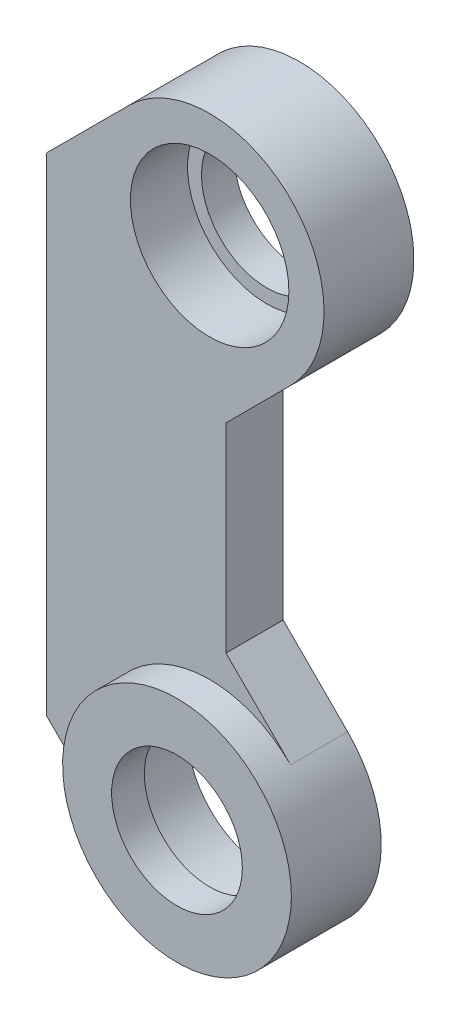
ISO-10303-21;
HEADER;
FILE_DESCRIPTION(('STEP AP214'),'2;1');
FILE_NAME('part.step','',(''),(''),'','','');
FILE_SCHEMA(('AUTOMOTIVE_DESIGN { 1 0 10303 214 1 1 1 1 }'));
ENDSEC;
DATA;
#1=APPLICATION_CONTEXT('core data for automotive mechanical design processes');
#2=APPLICATION_PROTOCOL_DEFINITION('international standard','automotive_design',2000,#1);
#3=PRODUCT_CONTEXT('',#1,'mechanical');
#4=PRODUCT('Part','Part','',(#3));
#5=PRODUCT_RELATED_PRODUCT_CATEGORY('part','',(#4));
#6=PRODUCT_DEFINITION_FORMATION('','',#4);
#7=PRODUCT_DEFINITION_CONTEXT('part definition',#1,'design');
#8=PRODUCT_DEFINITION('design','',#6,#7);
#9=PRODUCT_DEFINITION_SHAPE('','',#8);
#10=(LENGTH_UNIT() NAMED_UNIT(*) SI_UNIT(.MILLI.,.METRE.));
#11=(NAMED_UNIT(*) PLANE_ANGLE_UNIT() SI_UNIT($,.RADIAN.));
#12=(NAMED_UNIT(*) SI_UNIT($,.STERADIAN.) SOLID_ANGLE_UNIT());
#13=UNCERTAINTY_MEASURE_WITH_UNIT(LENGTH_MEASURE(1.E-05),#10,'distance_accuracy_value','');
#14=(GEOMETRIC_REPRESENTATION_CONTEXT(3) GLOBAL_UNCERTAINTY_ASSIGNED_CONTEXT((#13)) GLOBAL_UNIT_ASSIGNED_CONTEXT((#10,
#11,#12)) REPRESENTATION_CONTEXT('',''));
#15=CARTESIAN_POINT('',(0.,0.,0.));
#16=DIRECTION('',(0.,0.,1.));
#17=DIRECTION('',(1.,0.,0.));
#18=AXIS2_PLACEMENT_3D('',#15,#16,#17);
#19=CARTESIAN_POINT('',(-4.94974746830582,-4.94974746830584,3.5));
#20=DIRECTION('',(-0.707106781186546,-0.707106781186549,0.));
#21=DIRECTION('',(0.707106781186549,-0.707106781186546,0.));
#22=AXIS2_PLACEMENT_3D('',#19,#20,#21);
#23=PLANE('',#22);
#24=DIRECTION('',(-0.707106781186549,0.707106781186546,0.));
#25=VECTOR('',#24,1.);
#26=CARTESIAN_POINT('',(-4.94974746830582,-4.94974746830584,3.5));
#27=LINE('',#26,#25);
#28=CARTESIAN_POINT('',(-4.94974746830582,-4.94974746830584,3.5));
#29=VERTEX_POINT('',#28);
#30=CARTESIAN_POINT('',(-10.,0.100505063388337,3.5));
#31=VERTEX_POINT('',#30);
#32=EDGE_CURVE('E109',#29,#31,#27,.T.);
#33=ORIENTED_EDGE('',*,*,#32,.T.);
#34=DIRECTION('',(0.,0.,-1.));
#35=VECTOR('',#34,1.);
#36=CARTESIAN_POINT('',(-10.,0.10050506338834,3.5));
#37=LINE('',#36,#35);
#38=CARTESIAN_POINT('',(-10.,0.100505063388338,0.));
#39=VERTEX_POINT('',#38);
#40=EDGE_CURVE('E146',#31,#39,#37,.T.);
#41=ORIENTED_EDGE('',*,*,#40,.T.);
#42=DIRECTION('',(-0.707106781186549,0.707106781186546,0.));
#43=VECTOR('',#42,1.);
#44=CARTESIAN_POINT('',(-4.94974746830582,-4.94974746830584,0.));
#45=LINE('',#44,#43);
#46=CARTESIAN_POINT('',(-4.94974746830582,-4.94974746830584,0.));
#47=VERTEX_POINT('',#46);
#48=EDGE_CURVE('E111',#47,#39,#45,.T.);
#49=ORIENTED_EDGE('',*,*,#48,.F.);
#50=DIRECTION('',(0.,0.,-1.));
#51=VECTOR('',#50,1.);
#52=CARTESIAN_POINT('',(-4.94974746830582,-4.94974746830584,3.5));
#53=LINE('',#52,#51);
#54=EDGE_CURVE('E105',#29,#47,#53,.T.);
#55=ORIENTED_EDGE('',*,*,#54,.F.);
#56=EDGE_LOOP('',(#33,#41,#49,#55));
#57=FACE_BOUND('',#56,.T.);
#58=ADVANCED_FACE('F38',(#57),#23,.T.);
#59=CARTESIAN_POINT('',(0.,0.,3.5));
#60=DIRECTION('',(0.,0.,1.));
#61=DIRECTION('',(1.,0.,0.));
#62=AXIS2_PLACEMENT_3D('',#59,#60,#61);
#63=PLANE('',#62);
#64=CARTESIAN_POINT('',(0.,0.,3.5));
#65=DIRECTION('',(0.,0.,1.));
#66=DIRECTION('',(1.,0.,0.));
#67=AXIS2_PLACEMENT_3D('',#64,#65,#66);
#68=CIRCLE('',#67,7.);
#69=CARTESIAN_POINT('',(4.94974746830582,4.94974746830584,3.5));
#70=VERTEX_POINT('',#69);
#71=EDGE_CURVE('E123',#70,#29,#68,.T.);
#72=ORIENTED_EDGE('',*,*,#71,.F.);
#73=DIRECTION('',(-0.707106781186549,0.707106781186546,0.));
#74=VECTOR('',#73,1.);
#75=CARTESIAN_POINT('',(4.94974746830582,4.94974746830585,3.5));
#76=LINE('',#75,#74);
#77=CARTESIAN_POINT('',(0.999999999999977,8.89949493661167,3.5));
#78=VERTEX_POINT('',#77);
#79=EDGE_CURVE('E126',#70,#78,#76,.T.);
#80=ORIENTED_EDGE('',*,*,#79,.T.);
#81=DIRECTION('',(0.,1.,0.));
#82=VECTOR('',#81,1.);
#83=CARTESIAN_POINT('',(0.999999999999977,0.,3.5));
#84=LINE('',#83,#82);
#85=CARTESIAN_POINT('',(0.999999999999977,21.1005050633883,3.5));
#86=VERTEX_POINT('',#85);
#87=EDGE_CURVE('E63',#78,#86,#84,.T.);
#88=ORIENTED_EDGE('',*,*,#87,.T.);
#89=DIRECTION('',(0.707106781186549,0.707106781186546,0.));
#90=VECTOR('',#89,1.);
#91=CARTESIAN_POINT('',(-10.0502525316942,10.0502525316942,3.5));
#92=LINE('',#91,#90);
#93=CARTESIAN_POINT('',(4.94974746830582,25.0502525316942,3.5));
#94=VERTEX_POINT('',#93);
#95=EDGE_CURVE('E149',#86,#94,#92,.T.);
#96=ORIENTED_EDGE('',*,*,#95,.T.);
#97=CARTESIAN_POINT('',(0.,30.,3.5));
#98=DIRECTION('',(0.,0.,1.));
#99=DIRECTION('',(1.,0.,0.));
#100=AXIS2_PLACEMENT_3D('',#97,#98,#99);
#101=CIRCLE('',#100,7.);
#102=CARTESIAN_POINT('',(-4.94974746830582,34.9497474683058,3.5));
#103=VERTEX_POINT('',#102);
#104=EDGE_CURVE('E96',#94,#103,#101,.T.);
#105=ORIENTED_EDGE('',*,*,#104,.T.);
#106=DIRECTION('',(0.707106781186549,0.707106781186546,0.));
#107=VECTOR('',#106,1.);
#108=CARTESIAN_POINT('',(-19.9497474683058,19.9497474683059,3.5));
#109=LINE('',#108,#107);
#110=CARTESIAN_POINT('',(-10.,29.8994949366117,3.5));
#111=VERTEX_POINT('',#110);
#112=EDGE_CURVE('E127',#111,#103,#109,.T.);
#113=ORIENTED_EDGE('',*,*,#112,.F.);
#114=DIRECTION('',(0.,-1.,0.));
#115=VECTOR('',#114,1.);
#116=CARTESIAN_POINT('',(-10.,29.8994949366117,3.5));
#117=LINE('',#116,#115);
#118=EDGE_CURVE('E125',#111,#31,#117,.T.);
#119=ORIENTED_EDGE('',*,*,#118,.T.);
#120=ORIENTED_EDGE('',*,*,#32,.F.);
#121=EDGE_LOOP('',(#72,#80,#88,#96,#105,#113,#119,#120));
#122=FACE_BOUND('',#121,.T.);
#123=CARTESIAN_POINT('',(0.,30.,3.5));
#124=DIRECTION('',(0.,0.,1.));
#125=DIRECTION('',(1.,0.,0.));
#126=AXIS2_PLACEMENT_3D('',#123,#124,#125);
#127=CIRCLE('',#126,4.85);
#128=CARTESIAN_POINT('',(4.85,30.,3.5));
#129=VERTEX_POINT('',#128);
#130=EDGE_CURVE('E156',#129,#129,#127,.T.);
#131=ORIENTED_EDGE('',*,*,#130,.F.);
#132=EDGE_LOOP('',(#131));
#133=FACE_BOUND('',#132,.T.);
#134=ADVANCED_FACE('F120',(#122,#133),#63,.T.);
#135=CARTESIAN_POINT('',(0.,0.,0.));
#136=DIRECTION('',(0.,0.,1.));
#137=DIRECTION('',(1.,0.,0.));
#138=AXIS2_PLACEMENT_3D('',#135,#136,#137);
#139=PLANE('',#138);
#140=CARTESIAN_POINT('',(0.,30.,0.));
#141=DIRECTION('',(0.,0.,-1.));
#142=DIRECTION('',(-1.,0.,0.));
#143=AXIS2_PLACEMENT_3D('',#140,#141,#142);
#144=CIRCLE('',#143,7.);
#145=CARTESIAN_POINT('',(4.94974746830582,25.0502525316942,0.));
#146=VERTEX_POINT('',#145);
#147=CARTESIAN_POINT('',(-4.94974746830582,34.9497474683058,0.));
#148=VERTEX_POINT('',#147);
#149=EDGE_CURVE('E11',#146,#148,#144,.T.);
#150=ORIENTED_EDGE('',*,*,#149,.F.);
#151=DIRECTION('',(0.707106781186549,0.707106781186546,0.));
#152=VECTOR('',#151,1.);
#153=CARTESIAN_POINT('',(-10.0502525316942,10.0502525316942,0.));
#154=LINE('',#153,#152);
#155=CARTESIAN_POINT('',(0.999999999999977,21.1005050633883,0.));
#156=VERTEX_POINT('',#155);
#157=EDGE_CURVE('E148',#156,#146,#154,.T.);
#158=ORIENTED_EDGE('',*,*,#157,.F.);
#159=DIRECTION('',(0.,1.,0.));
#160=VECTOR('',#159,1.);
#161=CARTESIAN_POINT('',(0.999999999999977,0.,0.));
#162=LINE('',#161,#160);
#163=CARTESIAN_POINT('',(0.999999999999977,8.89949493661167,0.));
#164=VERTEX_POINT('',#163);
#165=EDGE_CURVE('E87',#164,#156,#162,.T.);
#166=ORIENTED_EDGE('',*,*,#165,.F.);
#167=DIRECTION('',(-0.707106781186549,0.707106781186546,0.));
#168=VECTOR('',#167,1.);
#169=CARTESIAN_POINT('',(4.94974746830582,4.94974746830585,0.));
#170=LINE('',#169,#168);
#171=CARTESIAN_POINT('',(4.94974746830582,4.94974746830584,0.));
#172=VERTEX_POINT('',#171);
#173=EDGE_CURVE('E170',#172,#164,#170,.T.);
#174=ORIENTED_EDGE('',*,*,#173,.F.);
#175=CARTESIAN_POINT('',(0.,0.,0.));
#176=DIRECTION('',(0.,0.,1.));
#177=DIRECTION('',(1.,0.,0.));
#178=AXIS2_PLACEMENT_3D('',#175,#176,#177);
#179=CIRCLE('',#178,7.);
#180=EDGE_CURVE('E168',#47,#172,#179,.T.);
#181=ORIENTED_EDGE('',*,*,#180,.F.);
#182=ORIENTED_EDGE('',*,*,#48,.T.);
#183=DIRECTION('',(0.,-1.,0.));
#184=VECTOR('',#183,1.);
#185=CARTESIAN_POINT('',(-10.,0.,0.));
#186=LINE('',#185,#184);
#187=CARTESIAN_POINT('',(-10.,29.8994949366117,0.));
#188=VERTEX_POINT('',#187);
#189=EDGE_CURVE('E42',#188,#39,#186,.T.);
#190=ORIENTED_EDGE('',*,*,#189,.F.);
#191=DIRECTION('',(0.707106781186549,0.707106781186546,0.));
#192=VECTOR('',#191,1.);
#193=CARTESIAN_POINT('',(-19.9497474683058,19.9497474683059,0.));
#194=LINE('',#193,#192);
#195=EDGE_CURVE('E164',#188,#148,#194,.T.);
#196=ORIENTED_EDGE('',*,*,#195,.T.);
#197=EDGE_LOOP('',(#150,#158,#166,#174,#181,#182,#190,#196));
#198=FACE_BOUND('',#197,.T.);
#199=CARTESIAN_POINT('',(0.,0.,0.));
#200=DIRECTION('',(0.,0.,1.));
#201=DIRECTION('',(1.,0.,0.));
#202=AXIS2_PLACEMENT_3D('',#199,#200,#201);
#203=CIRCLE('',#202,4.85);
#204=CARTESIAN_POINT('',(4.85,0.,0.));
#205=VERTEX_POINT('',#204);
#206=EDGE_CURVE('E173',#205,#205,#203,.T.);
#207=ORIENTED_EDGE('',*,*,#206,.T.);
#208=EDGE_LOOP('',(#207));
#209=FACE_BOUND('',#208,.T.);
#210=ADVANCED_FACE('F189',(#198,#209),#139,.F.);
#211=CARTESIAN_POINT('',(-10.0502525316942,10.0502525316942,3.5));
#212=DIRECTION('',(-0.707106781186546,0.707106781186549,0.));
#213=DIRECTION('',(-0.707106781186549,-0.707106781186546,0.));
#214=AXIS2_PLACEMENT_3D('',#211,#212,#213);
#215=PLANE('',#214);
#216=ORIENTED_EDGE('',*,*,#157,.T.);
#217=DIRECTION('',(0.,0.,-1.));
#218=VECTOR('',#217,1.);
#219=CARTESIAN_POINT('',(4.94974746830582,25.0502525316942,3.5));
#220=LINE('',#219,#218);
#221=EDGE_CURVE('E183',#94,#146,#220,.T.);
#222=ORIENTED_EDGE('',*,*,#221,.F.);
#223=ORIENTED_EDGE('',*,*,#95,.F.);
#224=DIRECTION('',(0.,0.,-1.));
#225=VECTOR('',#224,1.);
#226=CARTESIAN_POINT('',(0.999999999999977,21.1005050633883,3.5));
#227=LINE('',#226,#225);
#228=EDGE_CURVE('E161',#86,#156,#227,.T.);
#229=ORIENTED_EDGE('',*,*,#228,.T.);
#230=EDGE_LOOP('',(#216,#222,#223,#229));
#231=FACE_BOUND('',#230,.T.);
#232=ADVANCED_FACE('F40',(#231),#215,.F.);
#233=CARTESIAN_POINT('',(0.,30.,3.5));
#234=DIRECTION('',(0.,0.,-1.));
#235=DIRECTION('',(-1.,0.,0.));
#236=AXIS2_PLACEMENT_3D('',#233,#234,#235);
#237=CYLINDRICAL_SURFACE('',#236,7.);
#238=ORIENTED_EDGE('',*,*,#221,.T.);
#239=ORIENTED_EDGE('',*,*,#149,.T.);
#240=DIRECTION('',(0.,0.,-1.));
#241=VECTOR('',#240,1.);
#242=CARTESIAN_POINT('',(-4.94974746830582,34.9497474683058,3.5));
#243=LINE('',#242,#241);
#244=EDGE_CURVE('E115',#103,#148,#243,.T.);
#245=ORIENTED_EDGE('',*,*,#244,.F.);
#246=ORIENTED_EDGE('',*,*,#104,.F.);
#247=EDGE_LOOP('',(#238,#239,#245,#246));
#248=FACE_BOUND('',#247,.T.);
#249=CARTESIAN_POINT('',(0.,30.,-2.));
#250=DIRECTION('',(0.,0.,-1.));
#251=DIRECTION('',(-1.,0.,0.));
#252=AXIS2_PLACEMENT_3D('',#249,#250,#251);
#253=CIRCLE('',#252,7.);
#254=CARTESIAN_POINT('',(-7.,30.,-2.));
#255=VERTEX_POINT('',#254);
#256=EDGE_CURVE('E209',#255,#255,#253,.T.);
#257=ORIENTED_EDGE('',*,*,#256,.F.);
#258=EDGE_LOOP('',(#257));
#259=FACE_BOUND('',#258,.T.);
#260=ADVANCED_FACE('F204',(#248,#259),#237,.T.);
#261=CARTESIAN_POINT('',(-19.9497474683058,19.9497474683059,3.5));
#262=DIRECTION('',(-0.707106781186546,0.707106781186549,0.));
#263=DIRECTION('',(-0.707106781186549,-0.707106781186546,0.));
#264=AXIS2_PLACEMENT_3D('',#261,#262,#263);
#265=PLANE('',#264);
#266=DIRECTION('',(0.,0.,1.));
#267=VECTOR('',#266,1.);
#268=CARTESIAN_POINT('',(-10.,29.8994949366117,-0.5));
#269=LINE('',#268,#267);
#270=EDGE_CURVE('E54',#188,#111,#269,.T.);
#271=ORIENTED_EDGE('',*,*,#270,.T.);
#272=ORIENTED_EDGE('',*,*,#112,.T.);
#273=ORIENTED_EDGE('',*,*,#244,.T.);
#274=ORIENTED_EDGE('',*,*,#195,.F.);
#275=EDGE_LOOP('',(#271,#272,#273,#274));
#276=FACE_BOUND('',#275,.T.);
#277=ADVANCED_FACE('F202',(#276),#265,.T.);
#278=CARTESIAN_POINT('',(0.,0.,3.5));
#279=DIRECTION('',(0.,0.,-1.));
#280=DIRECTION('',(-1.,0.,0.));
#281=AXIS2_PLACEMENT_3D('',#278,#279,#280);
#282=CYLINDRICAL_SURFACE('',#281,7.);
#283=ORIENTED_EDGE('',*,*,#180,.T.);
#284=DIRECTION('',(0.,0.,-1.));
#285=VECTOR('',#284,1.);
#286=CARTESIAN_POINT('',(4.94974746830582,4.94974746830584,3.5));
#287=LINE('',#286,#285);
#288=EDGE_CURVE('E116',#70,#172,#287,.T.);
#289=ORIENTED_EDGE('',*,*,#288,.F.);
#290=ORIENTED_EDGE('',*,*,#71,.T.);
#291=ORIENTED_EDGE('',*,*,#54,.T.);
#292=EDGE_LOOP('',(#283,#289,#290,#291));
#293=FACE_BOUND('',#292,.T.);
#294=CARTESIAN_POINT('',(0.,0.,5.5));
#295=DIRECTION('',(0.,0.,1.));
#296=DIRECTION('',(1.,0.,0.));
#297=AXIS2_PLACEMENT_3D('',#294,#295,#296);
#298=CIRCLE('',#297,7.);
#299=CARTESIAN_POINT('',(7.,0.,5.5));
#300=VERTEX_POINT('',#299);
#301=EDGE_CURVE('E133',#300,#300,#298,.T.);
#302=ORIENTED_EDGE('',*,*,#301,.F.);
#303=EDGE_LOOP('',(#302));
#304=FACE_BOUND('',#303,.T.);
#305=ADVANCED_FACE('F130',(#293,#304),#282,.T.);
#306=CARTESIAN_POINT('',(4.94974746830582,4.94974746830585,3.5));
#307=DIRECTION('',(-0.707106781186546,-0.707106781186549,0.));
#308=DIRECTION('',(0.707106781186549,-0.707106781186546,0.));
#309=AXIS2_PLACEMENT_3D('',#306,#307,#308);
#310=PLANE('',#309);
#311=ORIENTED_EDGE('',*,*,#173,.T.);
#312=DIRECTION('',(0.,0.,-1.));
#313=VECTOR('',#312,1.);
#314=CARTESIAN_POINT('',(0.999999999999977,8.89949493661167,3.5));
#315=LINE('',#314,#313);
#316=EDGE_CURVE('E179',#78,#164,#315,.T.);
#317=ORIENTED_EDGE('',*,*,#316,.F.);
#318=ORIENTED_EDGE('',*,*,#79,.F.);
#319=ORIENTED_EDGE('',*,*,#288,.T.);
#320=EDGE_LOOP('',(#311,#317,#318,#319));
#321=FACE_BOUND('',#320,.T.);
#322=ADVANCED_FACE('F194',(#321),#310,.F.);
#323=CARTESIAN_POINT('',(0.,0.,3.5));
#324=DIRECTION('',(0.,0.,-1.));
#325=DIRECTION('',(-1.,0.,0.));
#326=AXIS2_PLACEMENT_3D('',#323,#324,#325);
#327=CYLINDRICAL_SURFACE('',#326,4.85);
#328=CARTESIAN_POINT('',(0.,0.,3.5));
#329=DIRECTION('',(0.,0.,1.));
#330=DIRECTION('',(1.,0.,0.));
#331=AXIS2_PLACEMENT_3D('',#328,#329,#330);
#332=CIRCLE('',#331,4.85);
#333=CARTESIAN_POINT('',(4.85,0.,3.5));
#334=VERTEX_POINT('',#333);
#335=EDGE_CURVE('E137',#334,#334,#332,.T.);
#336=ORIENTED_EDGE('',*,*,#335,.T.);
#337=EDGE_LOOP('',(#336));
#338=FACE_BOUND('',#337,.T.);
#339=ORIENTED_EDGE('',*,*,#206,.F.);
#340=EDGE_LOOP('',(#339));
#341=FACE_BOUND('',#340,.T.);
#342=ADVANCED_FACE('F249',(#338,#341),#327,.F.);
#343=CARTESIAN_POINT('',(0.999999999999977,0.,3.5));
#344=DIRECTION('',(-1.,0.,0.));
#345=DIRECTION('',(0.,0.,1.));
#346=AXIS2_PLACEMENT_3D('',#343,#344,#345);
#347=PLANE('',#346);
#348=ORIENTED_EDGE('',*,*,#165,.T.);
#349=ORIENTED_EDGE('',*,*,#228,.F.);
#350=ORIENTED_EDGE('',*,*,#87,.F.);
#351=ORIENTED_EDGE('',*,*,#316,.T.);
#352=EDGE_LOOP('',(#348,#349,#350,#351));
#353=FACE_BOUND('',#352,.T.);
#354=ADVANCED_FACE('F253',(#353),#347,.F.);
#355=CARTESIAN_POINT('',(0.,30.,3.5));
#356=DIRECTION('',(0.,0.,-1.));
#357=DIRECTION('',(-1.,0.,0.));
#358=AXIS2_PLACEMENT_3D('',#355,#356,#357);
#359=CYLINDRICAL_SURFACE('',#358,4.85);
#360=ORIENTED_EDGE('',*,*,#130,.T.);
#361=EDGE_LOOP('',(#360));
#362=FACE_BOUND('',#361,.T.);
#363=CARTESIAN_POINT('',(0.,30.,0.));
#364=DIRECTION('',(0.,0.,1.));
#365=DIRECTION('',(1.,0.,0.));
#366=AXIS2_PLACEMENT_3D('',#363,#364,#365);
#367=CIRCLE('',#366,4.85);
#368=CARTESIAN_POINT('',(4.85,30.,0.));
#369=VERTEX_POINT('',#368);
#370=EDGE_CURVE('E151',#369,#369,#367,.T.);
#371=ORIENTED_EDGE('',*,*,#370,.F.);
#372=EDGE_LOOP('',(#371));
#373=FACE_BOUND('',#372,.T.);
#374=ADVANCED_FACE('F258',(#362,#373),#359,.F.);
#375=CARTESIAN_POINT('',(-10.,29.8994949366117,-0.5));
#376=DIRECTION('',(-1.,0.,0.));
#377=DIRECTION('',(0.,-1.,0.));
#378=AXIS2_PLACEMENT_3D('',#375,#376,#377);
#379=PLANE('',#378);
#380=ORIENTED_EDGE('',*,*,#118,.F.);
#381=ORIENTED_EDGE('',*,*,#270,.F.);
#382=ORIENTED_EDGE('',*,*,#189,.T.);
#383=ORIENTED_EDGE('',*,*,#40,.F.);
#384=EDGE_LOOP('',(#380,#381,#382,#383));
#385=FACE_BOUND('',#384,.T.);
#386=ADVANCED_FACE('F186',(#385),#379,.T.);
#387=CARTESIAN_POINT('',(0.,0.,5.5));
#388=DIRECTION('',(0.,0.,1.));
#389=DIRECTION('',(1.,0.,0.));
#390=AXIS2_PLACEMENT_3D('',#387,#388,#389);
#391=PLANE('',#390);
#392=ORIENTED_EDGE('',*,*,#301,.T.);
#393=EDGE_LOOP('',(#392));
#394=FACE_BOUND('',#393,.T.);
#395=CARTESIAN_POINT('',(0.,0.,5.5));
#396=DIRECTION('',(0.,0.,1.));
#397=DIRECTION('',(1.,0.,0.));
#398=AXIS2_PLACEMENT_3D('',#395,#396,#397);
#399=CIRCLE('',#398,4.);
#400=CARTESIAN_POINT('',(4.,0.,5.5));
#401=VERTEX_POINT('',#400);
#402=EDGE_CURVE('E134',#401,#401,#399,.T.);
#403=ORIENTED_EDGE('',*,*,#402,.F.);
#404=EDGE_LOOP('',(#403));
#405=FACE_BOUND('',#404,.T.);
#406=ADVANCED_FACE('F267',(#394,#405),#391,.T.);
#407=CARTESIAN_POINT('',(0.,0.,3.5));
#408=DIRECTION('',(0.,0.,1.));
#409=DIRECTION('',(1.,0.,0.));
#410=AXIS2_PLACEMENT_3D('',#407,#408,#409);
#411=PLANE('',#410);
#412=ORIENTED_EDGE('',*,*,#335,.F.);
#413=EDGE_LOOP('',(#412));
#414=FACE_BOUND('',#413,.T.);
#415=CARTESIAN_POINT('',(0.,0.,3.5));
#416=DIRECTION('',(0.,0.,1.));
#417=DIRECTION('',(1.,0.,0.));
#418=AXIS2_PLACEMENT_3D('',#415,#416,#417);
#419=CIRCLE('',#418,4.);
#420=CARTESIAN_POINT('',(4.,0.,3.5));
#421=VERTEX_POINT('',#420);
#422=EDGE_CURVE('E140',#421,#421,#419,.T.);
#423=ORIENTED_EDGE('',*,*,#422,.T.);
#424=EDGE_LOOP('',(#423));
#425=FACE_BOUND('',#424,.T.);
#426=ADVANCED_FACE('F268',(#414,#425),#411,.F.);
#427=CARTESIAN_POINT('',(0.,0.,5.5));
#428=DIRECTION('',(0.,0.,-1.));
#429=DIRECTION('',(-1.,0.,0.));
#430=AXIS2_PLACEMENT_3D('',#427,#428,#429);
#431=CYLINDRICAL_SURFACE('',#430,4.);
#432=ORIENTED_EDGE('',*,*,#402,.T.);
#433=EDGE_LOOP('',(#432));
#434=FACE_BOUND('',#433,.T.);
#435=ORIENTED_EDGE('',*,*,#422,.F.);
#436=EDGE_LOOP('',(#435));
#437=FACE_BOUND('',#436,.T.);
#438=ADVANCED_FACE('F271',(#434,#437),#431,.F.);
#439=CARTESIAN_POINT('',(0.,30.,0.));
#440=DIRECTION('',(0.,0.,-1.));
#441=DIRECTION('',(-1.,0.,0.));
#442=AXIS2_PLACEMENT_3D('',#439,#440,#441);
#443=PLANE('',#442);
#444=CARTESIAN_POINT('',(0.,30.,0.));
#445=DIRECTION('',(0.,0.,-1.));
#446=DIRECTION('',(-1.,0.,0.));
#447=AXIS2_PLACEMENT_3D('',#444,#445,#446);
#448=CIRCLE('',#447,4.);
#449=CARTESIAN_POINT('',(-4.,30.,0.));
#450=VERTEX_POINT('',#449);
#451=EDGE_CURVE('E215',#450,#450,#448,.T.);
#452=ORIENTED_EDGE('',*,*,#451,.T.);
#453=EDGE_LOOP('',(#452));
#454=FACE_BOUND('',#453,.T.);
#455=ORIENTED_EDGE('',*,*,#370,.T.);
#456=EDGE_LOOP('',(#455));
#457=FACE_BOUND('',#456,.T.);
#458=ADVANCED_FACE('F221',(#454,#457),#443,.F.);
#459=CARTESIAN_POINT('',(0.,30.,-2.));
#460=DIRECTION('',(0.,0.,-1.));
#461=DIRECTION('',(-1.,0.,0.));
#462=AXIS2_PLACEMENT_3D('',#459,#460,#461);
#463=PLANE('',#462);
#464=ORIENTED_EDGE('',*,*,#256,.T.);
#465=EDGE_LOOP('',(#464));
#466=FACE_BOUND('',#465,.T.);
#467=CARTESIAN_POINT('',(0.,30.,-2.));
#468=DIRECTION('',(0.,0.,-1.));
#469=DIRECTION('',(-1.,0.,0.));
#470=AXIS2_PLACEMENT_3D('',#467,#468,#469);
#471=CIRCLE('',#470,4.);
#472=CARTESIAN_POINT('',(-4.,30.,-2.));
#473=VERTEX_POINT('',#472);
#474=EDGE_CURVE('E211',#473,#473,#471,.T.);
#475=ORIENTED_EDGE('',*,*,#474,.F.);
#476=EDGE_LOOP('',(#475));
#477=FACE_BOUND('',#476,.T.);
#478=ADVANCED_FACE('F226',(#466,#477),#463,.T.);
#479=CARTESIAN_POINT('',(0.,30.,-2.));
#480=DIRECTION('',(0.,0.,1.));
#481=DIRECTION('',(1.,0.,0.));
#482=AXIS2_PLACEMENT_3D('',#479,#480,#481);
#483=CYLINDRICAL_SURFACE('',#482,4.);
#484=ORIENTED_EDGE('',*,*,#474,.T.);
#485=EDGE_LOOP('',(#484));
#486=FACE_BOUND('',#485,.T.);
#487=ORIENTED_EDGE('',*,*,#451,.F.);
#488=EDGE_LOOP('',(#487));
#489=FACE_BOUND('',#488,.T.);
#490=ADVANCED_FACE('F224',(#486,#489),#483,.F.);
#491=CLOSED_SHELL('',(#58,#134,#210,#232,#260,#277,#305,#322,#342,#354,#374,#386,#406,#426,#438,
#458,#478,#490));
#492=MANIFOLD_SOLID_BREP('B2',#491);
#493=ADVANCED_BREP_SHAPE_REPRESENTATION('',(#18,#492),#14);
#494=SHAPE_DEFINITION_REPRESENTATION(#9,#493);
ENDSEC;
END-ISO-10303-21;
